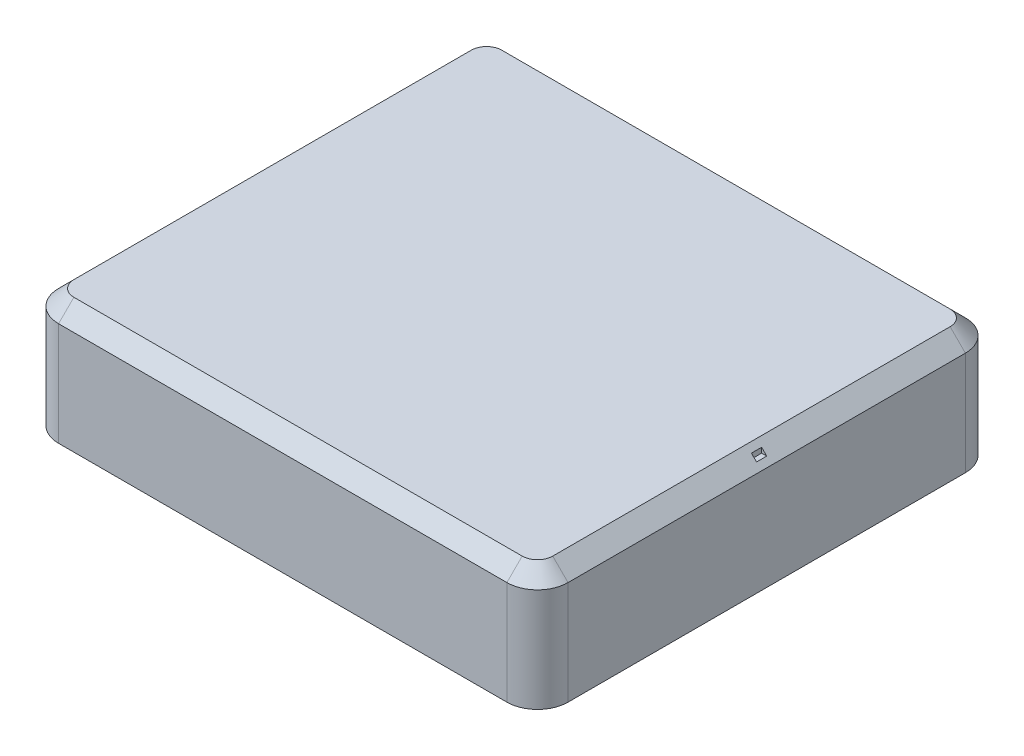
ISO-10303-21;
HEADER;
FILE_DESCRIPTION(('STEP AP214'),'2;1');
FILE_NAME('part.step','',(''),(''),'','','');
FILE_SCHEMA(('AUTOMOTIVE_DESIGN { 1 0 10303 214 1 1 1 1 }'));
ENDSEC;
DATA;
#1=APPLICATION_CONTEXT('core data for automotive mechanical design processes');
#2=APPLICATION_PROTOCOL_DEFINITION('international standard','automotive_design',2000,#1);
#3=PRODUCT_CONTEXT('',#1,'mechanical');
#4=PRODUCT('Part','Part','',(#3));
#5=PRODUCT_RELATED_PRODUCT_CATEGORY('part','',(#4));
#6=PRODUCT_DEFINITION_FORMATION('','',#4);
#7=PRODUCT_DEFINITION_CONTEXT('part definition',#1,'design');
#8=PRODUCT_DEFINITION('design','',#6,#7);
#9=PRODUCT_DEFINITION_SHAPE('','',#8);
#10=(LENGTH_UNIT() NAMED_UNIT(*) SI_UNIT(.MILLI.,.METRE.));
#11=(NAMED_UNIT(*) PLANE_ANGLE_UNIT() SI_UNIT($,.RADIAN.));
#12=(NAMED_UNIT(*) SI_UNIT($,.STERADIAN.) SOLID_ANGLE_UNIT());
#13=UNCERTAINTY_MEASURE_WITH_UNIT(LENGTH_MEASURE(1.E-05),#10,'distance_accuracy_value','');
#14=(GEOMETRIC_REPRESENTATION_CONTEXT(3) GLOBAL_UNCERTAINTY_ASSIGNED_CONTEXT((#13)) GLOBAL_UNIT_ASSIGNED_CONTEXT((#10,
#11,#12)) REPRESENTATION_CONTEXT('',''));
#15=CARTESIAN_POINT('',(0.,0.,0.));
#16=DIRECTION('',(0.,0.,1.));
#17=DIRECTION('',(1.,0.,0.));
#18=AXIS2_PLACEMENT_3D('',#15,#16,#17);
#19=CARTESIAN_POINT('',(0.,0.,45.));
#20=DIRECTION('',(0.,1.,0.));
#21=DIRECTION('',(0.,0.,1.));
#22=AXIS2_PLACEMENT_3D('',#19,#20,#21);
#23=PLANE('',#22);
#24=DIRECTION('',(1.,0.,0.));
#25=VECTOR('',#24,1.);
#26=CARTESIAN_POINT('',(1.3,0.,1.3));
#27=LINE('',#26,#25);
#28=CARTESIAN_POINT('',(2.3,0.,1.3));
#29=VERTEX_POINT('',#28);
#30=CARTESIAN_POINT('',(47.7,0.,1.3));
#31=VERTEX_POINT('',#30);
#32=EDGE_CURVE('E332',#29,#31,#27,.T.);
#33=ORIENTED_EDGE('',*,*,#32,.F.);
#34=CARTESIAN_POINT('',(2.30000000000001,0.,2.3));
#35=DIRECTION('',(0.,1.,0.));
#36=DIRECTION('',(0.,0.,1.));
#37=AXIS2_PLACEMENT_3D('',#34,#35,#36);
#38=CIRCLE('',#37,1.);
#39=CARTESIAN_POINT('',(1.3,0.,2.3));
#40=VERTEX_POINT('',#39);
#41=EDGE_CURVE('E178',#29,#40,#38,.T.);
#42=ORIENTED_EDGE('',*,*,#41,.T.);
#43=DIRECTION('',(0.,0.,-1.));
#44=VECTOR('',#43,1.);
#45=CARTESIAN_POINT('',(1.3,0.,43.7));
#46=LINE('',#45,#44);
#47=CARTESIAN_POINT('',(1.3,0.,42.7));
#48=VERTEX_POINT('',#47);
#49=EDGE_CURVE('E315',#48,#40,#46,.T.);
#50=ORIENTED_EDGE('',*,*,#49,.F.);
#51=CARTESIAN_POINT('',(2.3,0.,42.7));
#52=DIRECTION('',(0.,1.,0.));
#53=DIRECTION('',(0.,0.,1.));
#54=AXIS2_PLACEMENT_3D('',#51,#52,#53);
#55=CIRCLE('',#54,1.);
#56=CARTESIAN_POINT('',(2.3,0.,43.7));
#57=VERTEX_POINT('',#56);
#58=EDGE_CURVE('E187',#48,#57,#55,.T.);
#59=ORIENTED_EDGE('',*,*,#58,.T.);
#60=DIRECTION('',(-1.,0.,0.));
#61=VECTOR('',#60,1.);
#62=CARTESIAN_POINT('',(1.3,0.,43.7));
#63=LINE('',#62,#61);
#64=CARTESIAN_POINT('',(47.7,0.,43.7));
#65=VERTEX_POINT('',#64);
#66=EDGE_CURVE('E320',#65,#57,#63,.T.);
#67=ORIENTED_EDGE('',*,*,#66,.F.);
#68=CARTESIAN_POINT('',(47.7,0.,42.7));
#69=DIRECTION('',(0.,1.,0.));
#70=DIRECTION('',(0.,0.,1.));
#71=AXIS2_PLACEMENT_3D('',#68,#69,#70);
#72=CIRCLE('',#71,1.);
#73=CARTESIAN_POINT('',(48.7,0.,42.7));
#74=VERTEX_POINT('',#73);
#75=EDGE_CURVE('E184',#65,#74,#72,.T.);
#76=ORIENTED_EDGE('',*,*,#75,.T.);
#77=DIRECTION('',(0.,0.,1.));
#78=VECTOR('',#77,1.);
#79=CARTESIAN_POINT('',(48.7,0.,43.7));
#80=LINE('',#79,#78);
#81=CARTESIAN_POINT('',(48.7,0.,2.3));
#82=VERTEX_POINT('',#81);
#83=EDGE_CURVE('E335',#82,#74,#80,.T.);
#84=ORIENTED_EDGE('',*,*,#83,.F.);
#85=CARTESIAN_POINT('',(47.7,0.,2.3));
#86=DIRECTION('',(0.,1.,0.));
#87=DIRECTION('',(0.,0.,1.));
#88=AXIS2_PLACEMENT_3D('',#85,#86,#87);
#89=CIRCLE('',#88,1.);
#90=EDGE_CURVE('E181',#82,#31,#89,.T.);
#91=ORIENTED_EDGE('',*,*,#90,.T.);
#92=EDGE_LOOP('',(#33,#42,#50,#59,#67,#76,#84,#91));
#93=FACE_BOUND('',#92,.T.);
#94=DIRECTION('',(0.,0.,-1.));
#95=VECTOR('',#94,1.);
#96=CARTESIAN_POINT('',(0.,0.,45.));
#97=LINE('',#96,#95);
#98=CARTESIAN_POINT('',(0.,0.,42.));
#99=VERTEX_POINT('',#98);
#100=CARTESIAN_POINT('',(0.,0.,3.00000000000002));
#101=VERTEX_POINT('',#100);
#102=EDGE_CURVE('E139',#99,#101,#97,.T.);
#103=ORIENTED_EDGE('',*,*,#102,.T.);
#104=CARTESIAN_POINT('',(3.,0.,3.));
#105=DIRECTION('',(0.,1.,0.));
#106=DIRECTION('',(0.,0.,1.));
#107=AXIS2_PLACEMENT_3D('',#104,#105,#106);
#108=CIRCLE('',#107,3.);
#109=CARTESIAN_POINT('',(3.,0.,0.));
#110=VERTEX_POINT('',#109);
#111=EDGE_CURVE('E203',#101,#110,#108,.F.);
#112=ORIENTED_EDGE('',*,*,#111,.T.);
#113=DIRECTION('',(1.,0.,0.));
#114=VECTOR('',#113,1.);
#115=CARTESIAN_POINT('',(0.,0.,0.));
#116=LINE('',#115,#114);
#117=CARTESIAN_POINT('',(47.,0.,0.));
#118=VERTEX_POINT('',#117);
#119=EDGE_CURVE('E101',#110,#118,#116,.T.);
#120=ORIENTED_EDGE('',*,*,#119,.T.);
#121=CARTESIAN_POINT('',(47.,0.,3.));
#122=DIRECTION('',(0.,1.,0.));
#123=DIRECTION('',(0.,0.,1.));
#124=AXIS2_PLACEMENT_3D('',#121,#122,#123);
#125=CIRCLE('',#124,3.);
#126=CARTESIAN_POINT('',(50.,0.,3.00000000000002));
#127=VERTEX_POINT('',#126);
#128=EDGE_CURVE('E200',#118,#127,#125,.F.);
#129=ORIENTED_EDGE('',*,*,#128,.T.);
#130=DIRECTION('',(0.,0.,-1.));
#131=VECTOR('',#130,1.);
#132=CARTESIAN_POINT('',(50.,0.,45.));
#133=LINE('',#132,#131);
#134=CARTESIAN_POINT('',(50.,0.,42.));
#135=VERTEX_POINT('',#134);
#136=EDGE_CURVE('E134',#135,#127,#133,.T.);
#137=ORIENTED_EDGE('',*,*,#136,.F.);
#138=CARTESIAN_POINT('',(47.,0.,42.));
#139=DIRECTION('',(0.,1.,0.));
#140=DIRECTION('',(0.,0.,1.));
#141=AXIS2_PLACEMENT_3D('',#138,#139,#140);
#142=CIRCLE('',#141,3.);
#143=CARTESIAN_POINT('',(47.,0.,45.));
#144=VERTEX_POINT('',#143);
#145=EDGE_CURVE('E194',#135,#144,#142,.F.);
#146=ORIENTED_EDGE('',*,*,#145,.T.);
#147=DIRECTION('',(1.,0.,0.));
#148=VECTOR('',#147,1.);
#149=CARTESIAN_POINT('',(0.,0.,45.));
#150=LINE('',#149,#148);
#151=CARTESIAN_POINT('',(3.,0.,45.));
#152=VERTEX_POINT('',#151);
#153=EDGE_CURVE('E131',#152,#144,#150,.T.);
#154=ORIENTED_EDGE('',*,*,#153,.F.);
#155=CARTESIAN_POINT('',(3.,0.,42.));
#156=DIRECTION('',(0.,1.,0.));
#157=DIRECTION('',(0.,0.,1.));
#158=AXIS2_PLACEMENT_3D('',#155,#156,#157);
#159=CIRCLE('',#158,3.);
#160=EDGE_CURVE('E197',#152,#99,#159,.F.);
#161=ORIENTED_EDGE('',*,*,#160,.T.);
#162=EDGE_LOOP('',(#103,#112,#120,#129,#137,#146,#154,#161));
#163=FACE_BOUND('',#162,.T.);
#164=ADVANCED_FACE('F39',(#93,#163),#23,.F.);
#165=CARTESIAN_POINT('',(0.,0.,45.));
#166=DIRECTION('',(1.,0.,0.));
#167=DIRECTION('',(0.,0.,-1.));
#168=AXIS2_PLACEMENT_3D('',#165,#166,#167);
#169=PLANE('',#168);
#170=DIRECTION('',(0.,-1.,0.));
#171=VECTOR('',#170,1.);
#172=CARTESIAN_POINT('',(0.,0.,42.));
#173=LINE('',#172,#171);
#174=CARTESIAN_POINT('',(0.,10.1666666666667,42.));
#175=VERTEX_POINT('',#174);
#176=EDGE_CURVE('E190',#99,#175,#173,.F.);
#177=ORIENTED_EDGE('',*,*,#176,.T.);
#178=DIRECTION('',(0.,0.,-1.));
#179=VECTOR('',#178,1.);
#180=CARTESIAN_POINT('',(0.,10.1666666666667,45.));
#181=LINE('',#180,#179);
#182=CARTESIAN_POINT('',(0.,10.1666666666667,3.));
#183=VERTEX_POINT('',#182);
#184=EDGE_CURVE('E11',#175,#183,#181,.T.);
#185=ORIENTED_EDGE('',*,*,#184,.T.);
#186=DIRECTION('',(0.,-1.,0.));
#187=VECTOR('',#186,1.);
#188=CARTESIAN_POINT('',(0.,0.,3.));
#189=LINE('',#188,#187);
#190=EDGE_CURVE('E192',#183,#101,#189,.T.);
#191=ORIENTED_EDGE('',*,*,#190,.T.);
#192=ORIENTED_EDGE('',*,*,#102,.F.);
#193=EDGE_LOOP('',(#177,#185,#191,#192));
#194=FACE_BOUND('',#193,.T.);
#195=ADVANCED_FACE('F574',(#194),#169,.F.);
#196=CARTESIAN_POINT('',(50.,0.,45.));
#197=DIRECTION('',(-1.,0.,0.));
#198=DIRECTION('',(0.,0.,1.));
#199=AXIS2_PLACEMENT_3D('',#196,#197,#198);
#200=PLANE('',#199);
#201=DIRECTION('',(0.,1.,0.));
#202=VECTOR('',#201,1.);
#203=CARTESIAN_POINT('',(50.,11.6666666666667,3.));
#204=LINE('',#203,#202);
#205=CARTESIAN_POINT('',(50.,10.1666666666667,3.));
#206=VERTEX_POINT('',#205);
#207=EDGE_CURVE('E215',#127,#206,#204,.T.);
#208=ORIENTED_EDGE('',*,*,#207,.T.);
#209=DIRECTION('',(0.,0.,1.));
#210=VECTOR('',#209,1.);
#211=CARTESIAN_POINT('',(50.,10.1666666666667,45.));
#212=LINE('',#211,#210);
#213=CARTESIAN_POINT('',(50.,10.1666666666667,42.));
#214=VERTEX_POINT('',#213);
#215=EDGE_CURVE('E248',#206,#214,#212,.T.);
#216=ORIENTED_EDGE('',*,*,#215,.T.);
#217=DIRECTION('',(0.,1.,0.));
#218=VECTOR('',#217,1.);
#219=CARTESIAN_POINT('',(50.,0.,42.));
#220=LINE('',#219,#218);
#221=EDGE_CURVE('E212',#214,#135,#220,.F.);
#222=ORIENTED_EDGE('',*,*,#221,.T.);
#223=ORIENTED_EDGE('',*,*,#136,.T.);
#224=EDGE_LOOP('',(#208,#216,#222,#223));
#225=FACE_BOUND('',#224,.T.);
#226=ADVANCED_FACE('F544',(#225),#200,.F.);
#227=CARTESIAN_POINT('',(0.,11.6666666666667,45.));
#228=DIRECTION('',(0.,-1.,0.));
#229=DIRECTION('',(0.,0.,-1.));
#230=AXIS2_PLACEMENT_3D('',#227,#228,#229);
#231=PLANE('',#230);
#232=CARTESIAN_POINT('',(47.,11.6666666666667,42.));
#233=DIRECTION('',(0.,-1.,0.));
#234=DIRECTION('',(0.,0.,-1.));
#235=AXIS2_PLACEMENT_3D('',#232,#233,#234);
#236=CIRCLE('',#235,1.49999999999999);
#237=CARTESIAN_POINT('',(47.,11.6666666666667,43.5));
#238=VERTEX_POINT('',#237);
#239=CARTESIAN_POINT('',(48.5,11.6666666666667,42.));
#240=VERTEX_POINT('',#239);
#241=EDGE_CURVE('E242',#238,#240,#236,.F.);
#242=ORIENTED_EDGE('',*,*,#241,.T.);
#243=DIRECTION('',(0.,0.,-1.));
#244=VECTOR('',#243,1.);
#245=CARTESIAN_POINT('',(48.5,11.6666666666667,45.));
#246=LINE('',#245,#244);
#247=CARTESIAN_POINT('',(48.5,11.6666666666667,3.));
#248=VERTEX_POINT('',#247);
#249=EDGE_CURVE('E245',#240,#248,#246,.T.);
#250=ORIENTED_EDGE('',*,*,#249,.T.);
#251=CARTESIAN_POINT('',(47.,11.6666666666667,3.));
#252=DIRECTION('',(0.,-1.,0.));
#253=DIRECTION('',(0.,0.,-1.));
#254=AXIS2_PLACEMENT_3D('',#251,#252,#253);
#255=CIRCLE('',#254,1.49999999999999);
#256=CARTESIAN_POINT('',(47.,11.6666666666667,1.50000000000001));
#257=VERTEX_POINT('',#256);
#258=EDGE_CURVE('E239',#248,#257,#255,.F.);
#259=ORIENTED_EDGE('',*,*,#258,.T.);
#260=DIRECTION('',(-1.,0.,0.));
#261=VECTOR('',#260,1.);
#262=CARTESIAN_POINT('',(3.,11.6666666666667,1.50000000000001));
#263=LINE('',#262,#261);
#264=CARTESIAN_POINT('',(3.,11.6666666666667,1.50000000000001));
#265=VERTEX_POINT('',#264);
#266=EDGE_CURVE('E233',#257,#265,#263,.T.);
#267=ORIENTED_EDGE('',*,*,#266,.T.);
#268=CARTESIAN_POINT('',(3.,11.6666666666667,3.));
#269=DIRECTION('',(0.,-1.,0.));
#270=DIRECTION('',(0.,0.,-1.));
#271=AXIS2_PLACEMENT_3D('',#268,#269,#270);
#272=CIRCLE('',#271,1.49999999999999);
#273=CARTESIAN_POINT('',(1.50000000000001,11.6666666666667,3.));
#274=VERTEX_POINT('',#273);
#275=EDGE_CURVE('E227',#265,#274,#272,.F.);
#276=ORIENTED_EDGE('',*,*,#275,.T.);
#277=DIRECTION('',(0.,0.,1.));
#278=VECTOR('',#277,1.);
#279=CARTESIAN_POINT('',(1.50000000000001,11.6666666666667,45.));
#280=LINE('',#279,#278);
#281=CARTESIAN_POINT('',(1.50000000000001,11.6666666666667,42.));
#282=VERTEX_POINT('',#281);
#283=EDGE_CURVE('E224',#274,#282,#280,.T.);
#284=ORIENTED_EDGE('',*,*,#283,.T.);
#285=CARTESIAN_POINT('',(3.,11.6666666666667,42.));
#286=DIRECTION('',(0.,-1.,0.));
#287=DIRECTION('',(0.,0.,-1.));
#288=AXIS2_PLACEMENT_3D('',#285,#286,#287);
#289=CIRCLE('',#288,1.49999999999999);
#290=CARTESIAN_POINT('',(3.,11.6666666666667,43.5));
#291=VERTEX_POINT('',#290);
#292=EDGE_CURVE('E230',#282,#291,#289,.F.);
#293=ORIENTED_EDGE('',*,*,#292,.T.);
#294=DIRECTION('',(1.,0.,0.));
#295=VECTOR('',#294,1.);
#296=CARTESIAN_POINT('',(0.,11.6666666666667,43.5));
#297=LINE('',#296,#295);
#298=EDGE_CURVE('E236',#291,#238,#297,.T.);
#299=ORIENTED_EDGE('',*,*,#298,.T.);
#300=EDGE_LOOP('',(#242,#250,#259,#267,#276,#284,#293,#299));
#301=FACE_BOUND('',#300,.T.);
#302=ADVANCED_FACE('F579',(#301),#231,.F.);
#303=CARTESIAN_POINT('',(0.,0.,45.));
#304=DIRECTION('',(0.,0.,-1.));
#305=DIRECTION('',(-1.,0.,0.));
#306=AXIS2_PLACEMENT_3D('',#303,#304,#305);
#307=PLANE('',#306);
#308=DIRECTION('',(0.,1.,0.));
#309=VECTOR('',#308,1.);
#310=CARTESIAN_POINT('',(47.,0.,45.));
#311=LINE('',#310,#309);
#312=CARTESIAN_POINT('',(47.,10.1666666666667,45.));
#313=VERTEX_POINT('',#312);
#314=EDGE_CURVE('E218',#144,#313,#311,.T.);
#315=ORIENTED_EDGE('',*,*,#314,.T.);
#316=DIRECTION('',(-1.,0.,0.));
#317=VECTOR('',#316,1.);
#318=CARTESIAN_POINT('',(0.,10.1666666666667,45.));
#319=LINE('',#318,#317);
#320=CARTESIAN_POINT('',(3.,10.1666666666667,45.));
#321=VERTEX_POINT('',#320);
#322=EDGE_CURVE('E257',#313,#321,#319,.T.);
#323=ORIENTED_EDGE('',*,*,#322,.T.);
#324=DIRECTION('',(0.,-1.,0.));
#325=VECTOR('',#324,1.);
#326=CARTESIAN_POINT('',(3.,0.,45.));
#327=LINE('',#326,#325);
#328=EDGE_CURVE('E221',#321,#152,#327,.T.);
#329=ORIENTED_EDGE('',*,*,#328,.T.);
#330=ORIENTED_EDGE('',*,*,#153,.T.);
#331=EDGE_LOOP('',(#315,#323,#329,#330));
#332=FACE_BOUND('',#331,.T.);
#333=ADVANCED_FACE('F561',(#332),#307,.F.);
#334=CARTESIAN_POINT('',(0.,0.,0.));
#335=DIRECTION('',(0.,0.,-1.));
#336=DIRECTION('',(-1.,0.,0.));
#337=AXIS2_PLACEMENT_3D('',#334,#335,#336);
#338=PLANE('',#337);
#339=DIRECTION('',(0.,-1.,0.));
#340=VECTOR('',#339,1.);
#341=CARTESIAN_POINT('',(3.,11.6666666666667,0.));
#342=LINE('',#341,#340);
#343=CARTESIAN_POINT('',(3.,10.1666666666667,0.));
#344=VERTEX_POINT('',#343);
#345=EDGE_CURVE('E209',#110,#344,#342,.F.);
#346=ORIENTED_EDGE('',*,*,#345,.T.);
#347=DIRECTION('',(1.,0.,0.));
#348=VECTOR('',#347,1.);
#349=CARTESIAN_POINT('',(47.,10.1666666666667,0.));
#350=LINE('',#349,#348);
#351=CARTESIAN_POINT('',(47.,10.1666666666667,0.));
#352=VERTEX_POINT('',#351);
#353=EDGE_CURVE('E260',#344,#352,#350,.T.);
#354=ORIENTED_EDGE('',*,*,#353,.T.);
#355=DIRECTION('',(0.,1.,0.));
#356=VECTOR('',#355,1.);
#357=CARTESIAN_POINT('',(47.,0.,0.));
#358=LINE('',#357,#356);
#359=EDGE_CURVE('E206',#352,#118,#358,.F.);
#360=ORIENTED_EDGE('',*,*,#359,.T.);
#361=ORIENTED_EDGE('',*,*,#119,.F.);
#362=EDGE_LOOP('',(#346,#354,#360,#361));
#363=FACE_BOUND('',#362,.T.);
#364=ADVANCED_FACE('F525',(#363),#338,.T.);
#365=CARTESIAN_POINT('',(49.,11.6666666666667,23.));
#366=DIRECTION('',(0.,0.,1.));
#367=DIRECTION('',(1.,0.,0.));
#368=AXIS2_PLACEMENT_3D('',#365,#366,#367);
#369=PLANE('',#368);
#370=DIRECTION('',(-0.707106781186549,0.707106781186546,0.));
#371=VECTOR('',#370,1.);
#372=CARTESIAN_POINT('',(48.5,11.6666666666667,23.));
#373=LINE('',#372,#371);
#374=CARTESIAN_POINT('',(49.25,10.9166666666667,23.));
#375=VERTEX_POINT('',#374);
#376=CARTESIAN_POINT('',(49.5,10.6666666666667,23.));
#377=VERTEX_POINT('',#376);
#378=EDGE_CURVE('E111',#375,#377,#373,.F.);
#379=ORIENTED_EDGE('',*,*,#378,.T.);
#380=DIRECTION('',(1.,0.,0.));
#381=VECTOR('',#380,1.);
#382=CARTESIAN_POINT('',(49.,10.6666666666667,23.));
#383=LINE('',#382,#381);
#384=CARTESIAN_POINT('',(49.,10.6666666666667,23.));
#385=VERTEX_POINT('',#384);
#386=EDGE_CURVE('E103',#385,#377,#383,.T.);
#387=ORIENTED_EDGE('',*,*,#386,.F.);
#388=DIRECTION('',(0.,-1.,0.));
#389=VECTOR('',#388,1.);
#390=CARTESIAN_POINT('',(49.,11.6666666666667,23.));
#391=LINE('',#390,#389);
#392=CARTESIAN_POINT('',(49.,11.1666666666667,23.));
#393=VERTEX_POINT('',#392);
#394=EDGE_CURVE('E94',#393,#385,#391,.T.);
#395=ORIENTED_EDGE('',*,*,#394,.F.);
#396=DIRECTION('',(-0.707106781186549,0.707106781186546,0.));
#397=VECTOR('',#396,1.);
#398=CARTESIAN_POINT('',(48.5,11.6666666666667,23.));
#399=LINE('',#398,#397);
#400=EDGE_CURVE('E99',#393,#375,#399,.F.);
#401=ORIENTED_EDGE('',*,*,#400,.T.);
#402=EDGE_LOOP('',(#379,#387,#395,#401));
#403=FACE_BOUND('',#402,.T.);
#404=ADVANCED_FACE('F120',(#403),#369,.F.);
#405=CARTESIAN_POINT('',(49.,11.6666666666667,22.));
#406=DIRECTION('',(0.,0.,-1.));
#407=DIRECTION('',(-1.,0.,0.));
#408=AXIS2_PLACEMENT_3D('',#405,#406,#407);
#409=PLANE('',#408);
#410=DIRECTION('',(0.707106781186549,-0.707106781186546,0.));
#411=VECTOR('',#410,1.);
#412=CARTESIAN_POINT('',(48.5,11.6666666666667,22.));
#413=LINE('',#412,#411);
#414=CARTESIAN_POINT('',(49.5,10.6666666666667,22.));
#415=VERTEX_POINT('',#414);
#416=CARTESIAN_POINT('',(49.25,10.9166666666667,22.));
#417=VERTEX_POINT('',#416);
#418=EDGE_CURVE('E43',#415,#417,#413,.F.);
#419=ORIENTED_EDGE('',*,*,#418,.T.);
#420=DIRECTION('',(-0.707106781186549,0.707106781186546,0.));
#421=VECTOR('',#420,1.);
#422=CARTESIAN_POINT('',(48.75,11.4166666666667,22.));
#423=LINE('',#422,#421);
#424=CARTESIAN_POINT('',(49.,11.1666666666667,22.));
#425=VERTEX_POINT('',#424);
#426=EDGE_CURVE('E90',#425,#417,#423,.F.);
#427=ORIENTED_EDGE('',*,*,#426,.F.);
#428=DIRECTION('',(0.,1.,0.));
#429=VECTOR('',#428,1.);
#430=CARTESIAN_POINT('',(49.,11.6666666666667,22.));
#431=LINE('',#430,#429);
#432=CARTESIAN_POINT('',(49.,10.6666666666667,22.));
#433=VERTEX_POINT('',#432);
#434=EDGE_CURVE('E109',#433,#425,#431,.T.);
#435=ORIENTED_EDGE('',*,*,#434,.F.);
#436=DIRECTION('',(1.,0.,0.));
#437=VECTOR('',#436,1.);
#438=CARTESIAN_POINT('',(49.,10.6666666666667,22.));
#439=LINE('',#438,#437);
#440=EDGE_CURVE('E84',#433,#415,#439,.T.);
#441=ORIENTED_EDGE('',*,*,#440,.T.);
#442=EDGE_LOOP('',(#419,#427,#435,#441));
#443=FACE_BOUND('',#442,.T.);
#444=ADVANCED_FACE('F89',(#443),#409,.F.);
#445=CARTESIAN_POINT('',(49.,10.6666666666667,23.));
#446=DIRECTION('',(0.,-1.,0.));
#447=DIRECTION('',(0.,0.,-1.));
#448=AXIS2_PLACEMENT_3D('',#445,#446,#447);
#449=PLANE('',#448);
#450=DIRECTION('',(0.,0.,1.));
#451=VECTOR('',#450,1.);
#452=CARTESIAN_POINT('',(49.5,10.6666666666667,45.));
#453=LINE('',#452,#451);
#454=EDGE_CURVE('E95',#377,#415,#453,.F.);
#455=ORIENTED_EDGE('',*,*,#454,.T.);
#456=ORIENTED_EDGE('',*,*,#440,.F.);
#457=DIRECTION('',(0.,0.,-1.));
#458=VECTOR('',#457,1.);
#459=CARTESIAN_POINT('',(49.,10.6666666666667,23.));
#460=LINE('',#459,#458);
#461=EDGE_CURVE('E124',#385,#433,#460,.T.);
#462=ORIENTED_EDGE('',*,*,#461,.F.);
#463=ORIENTED_EDGE('',*,*,#386,.T.);
#464=EDGE_LOOP('',(#455,#456,#462,#463));
#465=FACE_BOUND('',#464,.T.);
#466=ADVANCED_FACE('F115',(#465),#449,.F.);
#467=CARTESIAN_POINT('',(49.,0.,0.));
#468=DIRECTION('',(1.,0.,0.));
#469=DIRECTION('',(0.,0.,-1.));
#470=AXIS2_PLACEMENT_3D('',#467,#468,#469);
#471=PLANE('',#470);
#472=ORIENTED_EDGE('',*,*,#394,.T.);
#473=ORIENTED_EDGE('',*,*,#461,.T.);
#474=ORIENTED_EDGE('',*,*,#434,.T.);
#475=DIRECTION('',(0.,0.,-1.));
#476=VECTOR('',#475,1.);
#477=CARTESIAN_POINT('',(49.,11.1666666666667,0.));
#478=LINE('',#477,#476);
#479=EDGE_CURVE('E98',#425,#393,#478,.F.);
#480=ORIENTED_EDGE('',*,*,#479,.T.);
#481=EDGE_LOOP('',(#472,#473,#474,#480));
#482=FACE_BOUND('',#481,.T.);
#483=ADVANCED_FACE('F126',(#482),#471,.T.);
#484=CARTESIAN_POINT('',(1.3,2.5,43.7));
#485=DIRECTION('',(-1.,0.,0.));
#486=DIRECTION('',(0.,0.,1.));
#487=AXIS2_PLACEMENT_3D('',#484,#485,#486);
#488=PLANE('',#487);
#489=ORIENTED_EDGE('',*,*,#49,.T.);
#490=DIRECTION('',(0.,-1.,0.));
#491=VECTOR('',#490,1.);
#492=CARTESIAN_POINT('',(1.3,2.5,2.3));
#493=LINE('',#492,#491);
#494=CARTESIAN_POINT('',(1.3,2.5,2.3));
#495=VERTEX_POINT('',#494);
#496=EDGE_CURVE('E151',#40,#495,#493,.F.);
#497=ORIENTED_EDGE('',*,*,#496,.T.);
#498=DIRECTION('',(0.,0.,-1.));
#499=VECTOR('',#498,1.);
#500=CARTESIAN_POINT('',(1.3,2.5,43.7));
#501=LINE('',#500,#499);
#502=CARTESIAN_POINT('',(1.3,2.5,42.7));
#503=VERTEX_POINT('',#502);
#504=EDGE_CURVE('E316',#503,#495,#501,.T.);
#505=ORIENTED_EDGE('',*,*,#504,.F.);
#506=DIRECTION('',(0.,-1.,0.));
#507=VECTOR('',#506,1.);
#508=CARTESIAN_POINT('',(1.3,0.,42.7));
#509=LINE('',#508,#507);
#510=EDGE_CURVE('E148',#503,#48,#509,.T.);
#511=ORIENTED_EDGE('',*,*,#510,.T.);
#512=EDGE_LOOP('',(#489,#497,#505,#511));
#513=FACE_BOUND('',#512,.T.);
#514=ADVANCED_FACE('F726',(#513),#488,.F.);
#515=CARTESIAN_POINT('',(1.3,2.5,43.7));
#516=DIRECTION('',(0.,0.,1.));
#517=DIRECTION('',(1.,0.,0.));
#518=AXIS2_PLACEMENT_3D('',#515,#516,#517);
#519=PLANE('',#518);
#520=DIRECTION('',(-1.,0.,0.));
#521=VECTOR('',#520,1.);
#522=CARTESIAN_POINT('',(1.3,2.5,43.7));
#523=LINE('',#522,#521);
#524=CARTESIAN_POINT('',(47.7,2.5,43.7));
#525=VERTEX_POINT('',#524);
#526=CARTESIAN_POINT('',(2.3,2.5,43.7));
#527=VERTEX_POINT('',#526);
#528=EDGE_CURVE('E326',#525,#527,#523,.T.);
#529=ORIENTED_EDGE('',*,*,#528,.F.);
#530=DIRECTION('',(0.,-1.,0.));
#531=VECTOR('',#530,1.);
#532=CARTESIAN_POINT('',(47.7,0.,43.7));
#533=LINE('',#532,#531);
#534=EDGE_CURVE('E175',#525,#65,#533,.T.);
#535=ORIENTED_EDGE('',*,*,#534,.T.);
#536=ORIENTED_EDGE('',*,*,#66,.T.);
#537=DIRECTION('',(0.,-1.,0.));
#538=VECTOR('',#537,1.);
#539=CARTESIAN_POINT('',(2.3,2.5,43.7));
#540=LINE('',#539,#538);
#541=EDGE_CURVE('E172',#57,#527,#540,.F.);
#542=ORIENTED_EDGE('',*,*,#541,.T.);
#543=EDGE_LOOP('',(#529,#535,#536,#542));
#544=FACE_BOUND('',#543,.T.);
#545=ADVANCED_FACE('F841',(#544),#519,.F.);
#546=CARTESIAN_POINT('',(48.7,2.5,43.7));
#547=DIRECTION('',(1.,0.,0.));
#548=DIRECTION('',(0.,0.,-1.));
#549=AXIS2_PLACEMENT_3D('',#546,#547,#548);
#550=PLANE('',#549);
#551=DIRECTION('',(0.,0.,1.));
#552=VECTOR('',#551,1.);
#553=CARTESIAN_POINT('',(48.7,2.5,43.7));
#554=LINE('',#553,#552);
#555=CARTESIAN_POINT('',(48.7,2.5,2.3));
#556=VERTEX_POINT('',#555);
#557=CARTESIAN_POINT('',(48.7,2.5,42.7));
#558=VERTEX_POINT('',#557);
#559=EDGE_CURVE('E323',#556,#558,#554,.T.);
#560=ORIENTED_EDGE('',*,*,#559,.F.);
#561=DIRECTION('',(0.,-1.,0.));
#562=VECTOR('',#561,1.);
#563=CARTESIAN_POINT('',(48.7,0.,2.3));
#564=LINE('',#563,#562);
#565=EDGE_CURVE('E169',#556,#82,#564,.T.);
#566=ORIENTED_EDGE('',*,*,#565,.T.);
#567=ORIENTED_EDGE('',*,*,#83,.T.);
#568=DIRECTION('',(0.,-1.,0.));
#569=VECTOR('',#568,1.);
#570=CARTESIAN_POINT('',(48.7,2.5,42.7));
#571=LINE('',#570,#569);
#572=EDGE_CURVE('E166',#74,#558,#571,.F.);
#573=ORIENTED_EDGE('',*,*,#572,.T.);
#574=EDGE_LOOP('',(#560,#566,#567,#573));
#575=FACE_BOUND('',#574,.T.);
#576=ADVANCED_FACE('F831',(#575),#550,.F.);
#577=CARTESIAN_POINT('',(1.3,2.5,1.3));
#578=DIRECTION('',(0.,0.,-1.));
#579=DIRECTION('',(-1.,0.,0.));
#580=AXIS2_PLACEMENT_3D('',#577,#578,#579);
#581=PLANE('',#580);
#582=DIRECTION('',(1.,0.,0.));
#583=VECTOR('',#582,1.);
#584=CARTESIAN_POINT('',(1.3,2.5,1.3));
#585=LINE('',#584,#583);
#586=CARTESIAN_POINT('',(2.3,2.5,1.3));
#587=VERTEX_POINT('',#586);
#588=CARTESIAN_POINT('',(47.7,2.5,1.3));
#589=VERTEX_POINT('',#588);
#590=EDGE_CURVE('E319',#587,#589,#585,.T.);
#591=ORIENTED_EDGE('',*,*,#590,.F.);
#592=DIRECTION('',(0.,-1.,0.));
#593=VECTOR('',#592,1.);
#594=CARTESIAN_POINT('',(2.30000000000001,0.,1.3));
#595=LINE('',#594,#593);
#596=EDGE_CURVE('E145',#587,#29,#595,.T.);
#597=ORIENTED_EDGE('',*,*,#596,.T.);
#598=ORIENTED_EDGE('',*,*,#32,.T.);
#599=DIRECTION('',(0.,-1.,0.));
#600=VECTOR('',#599,1.);
#601=CARTESIAN_POINT('',(47.7,2.5,1.3));
#602=LINE('',#601,#600);
#603=EDGE_CURVE('E142',#31,#589,#602,.F.);
#604=ORIENTED_EDGE('',*,*,#603,.T.);
#605=EDGE_LOOP('',(#591,#597,#598,#604));
#606=FACE_BOUND('',#605,.T.);
#607=ADVANCED_FACE('F820',(#606),#581,.F.);
#608=CARTESIAN_POINT('',(0.,2.5,0.));
#609=DIRECTION('',(0.,-1.,0.));
#610=DIRECTION('',(0.,0.,-1.));
#611=AXIS2_PLACEMENT_3D('',#608,#609,#610);
#612=PLANE('',#611);
#613=DIRECTION('',(-1.,0.,0.));
#614=VECTOR('',#613,1.);
#615=CARTESIAN_POINT('',(2.5,2.5,42.5));
#616=LINE('',#615,#614);
#617=CARTESIAN_POINT('',(47.5,2.5,42.5));
#618=VERTEX_POINT('',#617);
#619=CARTESIAN_POINT('',(2.5,2.5,42.5));
#620=VERTEX_POINT('',#619);
#621=EDGE_CURVE('E312',#618,#620,#616,.T.);
#622=ORIENTED_EDGE('',*,*,#621,.F.);
#623=DIRECTION('',(0.,0.,1.));
#624=VECTOR('',#623,1.);
#625=CARTESIAN_POINT('',(47.5,2.5,42.5));
#626=LINE('',#625,#624);
#627=CARTESIAN_POINT('',(47.5,2.5,2.5));
#628=VERTEX_POINT('',#627);
#629=EDGE_CURVE('E307',#628,#618,#626,.T.);
#630=ORIENTED_EDGE('',*,*,#629,.F.);
#631=DIRECTION('',(1.,0.,0.));
#632=VECTOR('',#631,1.);
#633=CARTESIAN_POINT('',(2.5,2.5,2.5));
#634=LINE('',#633,#632);
#635=CARTESIAN_POINT('',(2.5,2.5,2.5));
#636=VERTEX_POINT('',#635);
#637=EDGE_CURVE('E298',#636,#628,#634,.T.);
#638=ORIENTED_EDGE('',*,*,#637,.F.);
#639=DIRECTION('',(0.,0.,-1.));
#640=VECTOR('',#639,1.);
#641=CARTESIAN_POINT('',(2.5,2.5,42.5));
#642=LINE('',#641,#640);
#643=EDGE_CURVE('E292',#620,#636,#642,.T.);
#644=ORIENTED_EDGE('',*,*,#643,.F.);
#645=EDGE_LOOP('',(#622,#630,#638,#644));
#646=FACE_BOUND('',#645,.T.);
#647=ORIENTED_EDGE('',*,*,#504,.T.);
#648=CARTESIAN_POINT('',(2.30000000000001,2.5,2.3));
#649=DIRECTION('',(0.,-1.,0.));
#650=DIRECTION('',(0.,0.,-1.));
#651=AXIS2_PLACEMENT_3D('',#648,#649,#650);
#652=CIRCLE('',#651,1.);
#653=EDGE_CURVE('E163',#495,#587,#652,.T.);
#654=ORIENTED_EDGE('',*,*,#653,.T.);
#655=ORIENTED_EDGE('',*,*,#590,.T.);
#656=CARTESIAN_POINT('',(47.7,2.5,2.3));
#657=DIRECTION('',(0.,-1.,0.));
#658=DIRECTION('',(0.,0.,-1.));
#659=AXIS2_PLACEMENT_3D('',#656,#657,#658);
#660=CIRCLE('',#659,1.);
#661=EDGE_CURVE('E160',#589,#556,#660,.T.);
#662=ORIENTED_EDGE('',*,*,#661,.T.);
#663=ORIENTED_EDGE('',*,*,#559,.T.);
#664=CARTESIAN_POINT('',(47.7,2.5,42.7));
#665=DIRECTION('',(0.,-1.,0.));
#666=DIRECTION('',(0.,0.,-1.));
#667=AXIS2_PLACEMENT_3D('',#664,#665,#666);
#668=CIRCLE('',#667,1.);
#669=EDGE_CURVE('E157',#558,#525,#668,.T.);
#670=ORIENTED_EDGE('',*,*,#669,.T.);
#671=ORIENTED_EDGE('',*,*,#528,.T.);
#672=CARTESIAN_POINT('',(2.3,2.5,42.7));
#673=DIRECTION('',(0.,-1.,0.));
#674=DIRECTION('',(0.,0.,-1.));
#675=AXIS2_PLACEMENT_3D('',#672,#673,#674);
#676=CIRCLE('',#675,1.);
#677=EDGE_CURVE('E154',#527,#503,#676,.T.);
#678=ORIENTED_EDGE('',*,*,#677,.T.);
#679=EDGE_LOOP('',(#647,#654,#655,#662,#663,#670,#671,#678));
#680=FACE_BOUND('',#679,.T.);
#681=ADVANCED_FACE('F815',(#646,#680),#612,.T.);
#682=CARTESIAN_POINT('',(46.5,0.,0.));
#683=DIRECTION('',(1.,0.,0.));
#684=DIRECTION('',(0.,0.,-1.));
#685=AXIS2_PLACEMENT_3D('',#682,#683,#684);
#686=PLANE('',#685);
#687=DIRECTION('',(0.,-1.,0.));
#688=VECTOR('',#687,1.);
#689=CARTESIAN_POINT('',(46.5,0.,25.5));
#690=LINE('',#689,#688);
#691=CARTESIAN_POINT('',(46.5,9.16666666666666,25.5));
#692=VERTEX_POINT('',#691);
#693=CARTESIAN_POINT('',(46.5,8.16666666666666,25.5));
#694=VERTEX_POINT('',#693);
#695=EDGE_CURVE('E384',#692,#694,#690,.T.);
#696=ORIENTED_EDGE('',*,*,#695,.F.);
#697=DIRECTION('',(0.,0.,1.));
#698=VECTOR('',#697,1.);
#699=CARTESIAN_POINT('',(46.5,9.16666666666666,45.));
#700=LINE('',#699,#698);
#701=CARTESIAN_POINT('',(46.5,9.16666666666666,19.5));
#702=VERTEX_POINT('',#701);
#703=EDGE_CURVE('E358',#702,#692,#700,.T.);
#704=ORIENTED_EDGE('',*,*,#703,.F.);
#705=DIRECTION('',(0.,1.,0.));
#706=VECTOR('',#705,1.);
#707=CARTESIAN_POINT('',(46.5,0.,19.5));
#708=LINE('',#707,#706);
#709=CARTESIAN_POINT('',(46.5,8.16666666666666,19.5));
#710=VERTEX_POINT('',#709);
#711=EDGE_CURVE('E362',#710,#702,#708,.T.);
#712=ORIENTED_EDGE('',*,*,#711,.F.);
#713=DIRECTION('',(0.,0.,-1.));
#714=VECTOR('',#713,1.);
#715=CARTESIAN_POINT('',(46.5,8.16666666666666,0.));
#716=LINE('',#715,#714);
#717=EDGE_CURVE('E389',#694,#710,#716,.T.);
#718=ORIENTED_EDGE('',*,*,#717,.F.);
#719=EDGE_LOOP('',(#696,#704,#712,#718));
#720=FACE_BOUND('',#719,.T.);
#721=ADVANCED_FACE('F416',(#720),#686,.F.);
#722=CARTESIAN_POINT('',(49.,11.6666666666667,19.5));
#723=DIRECTION('',(0.,0.,-1.));
#724=DIRECTION('',(-1.,0.,0.));
#725=AXIS2_PLACEMENT_3D('',#722,#723,#724);
#726=PLANE('',#725);
#727=DIRECTION('',(0.,1.,0.));
#728=VECTOR('',#727,1.);
#729=CARTESIAN_POINT('',(47.5,11.6666666666667,19.5));
#730=LINE('',#729,#728);
#731=CARTESIAN_POINT('',(47.5,8.16666666666666,19.5));
#732=VERTEX_POINT('',#731);
#733=CARTESIAN_POINT('',(47.5,9.16666666666666,19.5));
#734=VERTEX_POINT('',#733);
#735=EDGE_CURVE('E375',#732,#734,#730,.T.);
#736=ORIENTED_EDGE('',*,*,#735,.F.);
#737=DIRECTION('',(1.,0.,0.));
#738=VECTOR('',#737,1.);
#739=CARTESIAN_POINT('',(49.,8.16666666666666,19.5));
#740=LINE('',#739,#738);
#741=EDGE_CURVE('E365',#710,#732,#740,.T.);
#742=ORIENTED_EDGE('',*,*,#741,.F.);
#743=ORIENTED_EDGE('',*,*,#711,.T.);
#744=DIRECTION('',(1.,0.,0.));
#745=VECTOR('',#744,1.);
#746=CARTESIAN_POINT('',(0.,9.16666666666666,19.5));
#747=LINE('',#746,#745);
#748=EDGE_CURVE('E357',#702,#734,#747,.T.);
#749=ORIENTED_EDGE('',*,*,#748,.T.);
#750=EDGE_LOOP('',(#736,#742,#743,#749));
#751=FACE_BOUND('',#750,.T.);
#752=ADVANCED_FACE('F400',(#751),#726,.T.);
#753=CARTESIAN_POINT('',(49.,8.16666666666666,23.));
#754=DIRECTION('',(0.,-1.,0.));
#755=DIRECTION('',(0.,0.,-1.));
#756=AXIS2_PLACEMENT_3D('',#753,#754,#755);
#757=PLANE('',#756);
#758=DIRECTION('',(0.,0.,-1.));
#759=VECTOR('',#758,1.);
#760=CARTESIAN_POINT('',(47.5,8.16666666666666,23.));
#761=LINE('',#760,#759);
#762=CARTESIAN_POINT('',(47.5,8.16666666666666,25.5));
#763=VERTEX_POINT('',#762);
#764=EDGE_CURVE('E372',#763,#732,#761,.T.);
#765=ORIENTED_EDGE('',*,*,#764,.F.);
#766=DIRECTION('',(1.,0.,0.));
#767=VECTOR('',#766,1.);
#768=CARTESIAN_POINT('',(49.,8.16666666666666,25.5));
#769=LINE('',#768,#767);
#770=EDGE_CURVE('E361',#694,#763,#769,.T.);
#771=ORIENTED_EDGE('',*,*,#770,.F.);
#772=ORIENTED_EDGE('',*,*,#717,.T.);
#773=ORIENTED_EDGE('',*,*,#741,.T.);
#774=EDGE_LOOP('',(#765,#771,#772,#773));
#775=FACE_BOUND('',#774,.T.);
#776=ADVANCED_FACE('F910',(#775),#757,.T.);
#777=CARTESIAN_POINT('',(49.,11.6666666666667,25.5));
#778=DIRECTION('',(0.,0.,1.));
#779=DIRECTION('',(1.,0.,0.));
#780=AXIS2_PLACEMENT_3D('',#777,#778,#779);
#781=PLANE('',#780);
#782=DIRECTION('',(0.,-1.,0.));
#783=VECTOR('',#782,1.);
#784=CARTESIAN_POINT('',(47.5,11.6666666666667,25.5));
#785=LINE('',#784,#783);
#786=CARTESIAN_POINT('',(47.5,9.16666666666666,25.5));
#787=VERTEX_POINT('',#786);
#788=EDGE_CURVE('E329',#787,#763,#785,.T.);
#789=ORIENTED_EDGE('',*,*,#788,.F.);
#790=DIRECTION('',(1.,0.,0.));
#791=VECTOR('',#790,1.);
#792=CARTESIAN_POINT('',(49.,9.16666666666666,25.5));
#793=LINE('',#792,#791);
#794=EDGE_CURVE('E343',#692,#787,#793,.T.);
#795=ORIENTED_EDGE('',*,*,#794,.F.);
#796=ORIENTED_EDGE('',*,*,#695,.T.);
#797=ORIENTED_EDGE('',*,*,#770,.T.);
#798=EDGE_LOOP('',(#789,#795,#796,#797));
#799=FACE_BOUND('',#798,.T.);
#800=ADVANCED_FACE('F422',(#799),#781,.T.);
#801=CARTESIAN_POINT('',(0.,9.16666666666666,45.));
#802=DIRECTION('',(0.,-1.,0.));
#803=DIRECTION('',(0.,0.,-1.));
#804=AXIS2_PLACEMENT_3D('',#801,#802,#803);
#805=PLANE('',#804);
#806=DIRECTION('',(0.,0.,-1.));
#807=VECTOR('',#806,1.);
#808=CARTESIAN_POINT('',(47.5,9.16666666666666,45.));
#809=LINE('',#808,#807);
#810=CARTESIAN_POINT('',(47.5,9.16666666666666,42.5));
#811=VERTEX_POINT('',#810);
#812=EDGE_CURVE('E113',#811,#787,#809,.T.);
#813=ORIENTED_EDGE('',*,*,#812,.F.);
#814=DIRECTION('',(-1.,0.,0.));
#815=VECTOR('',#814,1.);
#816=CARTESIAN_POINT('',(0.,9.16666666666666,42.5));
#817=LINE('',#816,#815);
#818=CARTESIAN_POINT('',(2.5,9.16666666666666,42.5));
#819=VERTEX_POINT('',#818);
#820=EDGE_CURVE('E352',#811,#819,#817,.T.);
#821=ORIENTED_EDGE('',*,*,#820,.T.);
#822=DIRECTION('',(0.,0.,-1.));
#823=VECTOR('',#822,1.);
#824=CARTESIAN_POINT('',(2.5,9.16666666666666,45.));
#825=LINE('',#824,#823);
#826=CARTESIAN_POINT('',(2.5,9.16666666666666,2.5));
#827=VERTEX_POINT('',#826);
#828=EDGE_CURVE('E348',#819,#827,#825,.T.);
#829=ORIENTED_EDGE('',*,*,#828,.T.);
#830=DIRECTION('',(-1.,0.,0.));
#831=VECTOR('',#830,1.);
#832=CARTESIAN_POINT('',(0.,9.16666666666666,2.5));
#833=LINE('',#832,#831);
#834=CARTESIAN_POINT('',(47.5,9.16666666666666,2.5));
#835=VERTEX_POINT('',#834);
#836=EDGE_CURVE('E347',#835,#827,#833,.T.);
#837=ORIENTED_EDGE('',*,*,#836,.F.);
#838=DIRECTION('',(0.,0.,-1.));
#839=VECTOR('',#838,1.);
#840=CARTESIAN_POINT('',(47.5,9.16666666666666,45.));
#841=LINE('',#840,#839);
#842=EDGE_CURVE('E351',#734,#835,#841,.T.);
#843=ORIENTED_EDGE('',*,*,#842,.F.);
#844=ORIENTED_EDGE('',*,*,#748,.F.);
#845=ORIENTED_EDGE('',*,*,#703,.T.);
#846=ORIENTED_EDGE('',*,*,#794,.T.);
#847=EDGE_LOOP('',(#813,#821,#829,#837,#843,#844,#845,#846));
#848=FACE_BOUND('',#847,.T.);
#849=ADVANCED_FACE('F411',(#848),#805,.T.);
#850=CARTESIAN_POINT('',(0.,0.,42.5));
#851=DIRECTION('',(0.,0.,-1.));
#852=DIRECTION('',(-1.,0.,0.));
#853=AXIS2_PLACEMENT_3D('',#850,#851,#852);
#854=PLANE('',#853);
#855=DIRECTION('',(0.,1.,0.));
#856=VECTOR('',#855,1.);
#857=CARTESIAN_POINT('',(47.5,0.,42.5));
#858=LINE('',#857,#856);
#859=EDGE_CURVE('E346',#618,#811,#858,.T.);
#860=ORIENTED_EDGE('',*,*,#859,.F.);
#861=ORIENTED_EDGE('',*,*,#621,.T.);
#862=DIRECTION('',(0.,-1.,0.));
#863=VECTOR('',#862,1.);
#864=CARTESIAN_POINT('',(2.5,0.,42.5));
#865=LINE('',#864,#863);
#866=EDGE_CURVE('E344',#819,#620,#865,.T.);
#867=ORIENTED_EDGE('',*,*,#866,.F.);
#868=ORIENTED_EDGE('',*,*,#820,.F.);
#869=EDGE_LOOP('',(#860,#861,#867,#868));
#870=FACE_BOUND('',#869,.T.);
#871=ADVANCED_FACE('F887',(#870),#854,.T.);
#872=CARTESIAN_POINT('',(0.,0.,2.5));
#873=DIRECTION('',(0.,0.,-1.));
#874=DIRECTION('',(-1.,0.,0.));
#875=AXIS2_PLACEMENT_3D('',#872,#873,#874);
#876=PLANE('',#875);
#877=ORIENTED_EDGE('',*,*,#637,.T.);
#878=DIRECTION('',(0.,1.,0.));
#879=VECTOR('',#878,1.);
#880=CARTESIAN_POINT('',(47.5,0.,2.5));
#881=LINE('',#880,#879);
#882=EDGE_CURVE('E342',#628,#835,#881,.T.);
#883=ORIENTED_EDGE('',*,*,#882,.T.);
#884=ORIENTED_EDGE('',*,*,#836,.T.);
#885=DIRECTION('',(0.,-1.,0.));
#886=VECTOR('',#885,1.);
#887=CARTESIAN_POINT('',(2.5,0.,2.5));
#888=LINE('',#887,#886);
#889=EDGE_CURVE('E340',#827,#636,#888,.T.);
#890=ORIENTED_EDGE('',*,*,#889,.T.);
#891=EDGE_LOOP('',(#877,#883,#884,#890));
#892=FACE_BOUND('',#891,.T.);
#893=ADVANCED_FACE('F876',(#892),#876,.F.);
#894=CARTESIAN_POINT('',(47.5,0.,45.));
#895=DIRECTION('',(-1.,0.,0.));
#896=DIRECTION('',(0.,0.,1.));
#897=AXIS2_PLACEMENT_3D('',#894,#895,#896);
#898=PLANE('',#897);
#899=ORIENTED_EDGE('',*,*,#882,.F.);
#900=ORIENTED_EDGE('',*,*,#629,.T.);
#901=ORIENTED_EDGE('',*,*,#859,.T.);
#902=ORIENTED_EDGE('',*,*,#812,.T.);
#903=ORIENTED_EDGE('',*,*,#788,.T.);
#904=ORIENTED_EDGE('',*,*,#764,.T.);
#905=ORIENTED_EDGE('',*,*,#735,.T.);
#906=ORIENTED_EDGE('',*,*,#842,.T.);
#907=EDGE_LOOP('',(#899,#900,#901,#902,#903,#904,#905,#906));
#908=FACE_BOUND('',#907,.T.);
#909=ADVANCED_FACE('F867',(#908),#898,.T.);
#910=CARTESIAN_POINT('',(2.5,0.,45.));
#911=DIRECTION('',(1.,0.,0.));
#912=DIRECTION('',(0.,0.,-1.));
#913=AXIS2_PLACEMENT_3D('',#910,#911,#912);
#914=PLANE('',#913);
#915=ORIENTED_EDGE('',*,*,#866,.T.);
#916=ORIENTED_EDGE('',*,*,#643,.T.);
#917=ORIENTED_EDGE('',*,*,#889,.F.);
#918=ORIENTED_EDGE('',*,*,#828,.F.);
#919=EDGE_LOOP('',(#915,#916,#917,#918));
#920=FACE_BOUND('',#919,.T.);
#921=ADVANCED_FACE('F603',(#920),#914,.T.);
#922=CARTESIAN_POINT('',(2.30000000000001,2.5,2.3));
#923=DIRECTION('',(0.,1.,0.));
#924=DIRECTION('',(0.,0.,1.));
#925=AXIS2_PLACEMENT_3D('',#922,#923,#924);
#926=CYLINDRICAL_SURFACE('',#925,1.);
#927=ORIENTED_EDGE('',*,*,#653,.F.);
#928=ORIENTED_EDGE('',*,*,#496,.F.);
#929=ORIENTED_EDGE('',*,*,#41,.F.);
#930=ORIENTED_EDGE('',*,*,#596,.F.);
#931=EDGE_LOOP('',(#927,#928,#929,#930));
#932=FACE_BOUND('',#931,.T.);
#933=ADVANCED_FACE('F599',(#932),#926,.F.);
#934=CARTESIAN_POINT('',(47.7,2.5,2.3));
#935=DIRECTION('',(0.,1.,0.));
#936=DIRECTION('',(0.,0.,1.));
#937=AXIS2_PLACEMENT_3D('',#934,#935,#936);
#938=CYLINDRICAL_SURFACE('',#937,1.);
#939=ORIENTED_EDGE('',*,*,#661,.F.);
#940=ORIENTED_EDGE('',*,*,#603,.F.);
#941=ORIENTED_EDGE('',*,*,#90,.F.);
#942=ORIENTED_EDGE('',*,*,#565,.F.);
#943=EDGE_LOOP('',(#939,#940,#941,#942));
#944=FACE_BOUND('',#943,.T.);
#945=ADVANCED_FACE('F602',(#944),#938,.F.);
#946=CARTESIAN_POINT('',(47.7,2.5,42.7));
#947=DIRECTION('',(0.,1.,0.));
#948=DIRECTION('',(0.,0.,1.));
#949=AXIS2_PLACEMENT_3D('',#946,#947,#948);
#950=CYLINDRICAL_SURFACE('',#949,1.);
#951=ORIENTED_EDGE('',*,*,#669,.F.);
#952=ORIENTED_EDGE('',*,*,#572,.F.);
#953=ORIENTED_EDGE('',*,*,#75,.F.);
#954=ORIENTED_EDGE('',*,*,#534,.F.);
#955=EDGE_LOOP('',(#951,#952,#953,#954));
#956=FACE_BOUND('',#955,.T.);
#957=ADVANCED_FACE('F607',(#956),#950,.F.);
#958=CARTESIAN_POINT('',(2.3,2.5,42.7));
#959=DIRECTION('',(0.,1.,0.));
#960=DIRECTION('',(0.,0.,1.));
#961=AXIS2_PLACEMENT_3D('',#958,#959,#960);
#962=CYLINDRICAL_SURFACE('',#961,1.);
#963=ORIENTED_EDGE('',*,*,#677,.F.);
#964=ORIENTED_EDGE('',*,*,#541,.F.);
#965=ORIENTED_EDGE('',*,*,#58,.F.);
#966=ORIENTED_EDGE('',*,*,#510,.F.);
#967=EDGE_LOOP('',(#963,#964,#965,#966));
#968=FACE_BOUND('',#967,.T.);
#969=ADVANCED_FACE('F611',(#968),#962,.F.);
#970=CARTESIAN_POINT('',(3.,0.,3.));
#971=DIRECTION('',(0.,1.,0.));
#972=DIRECTION('',(0.,0.,1.));
#973=AXIS2_PLACEMENT_3D('',#970,#971,#972);
#974=CYLINDRICAL_SURFACE('',#973,3.);
#975=ORIENTED_EDGE('',*,*,#190,.F.);
#976=CARTESIAN_POINT('',(3.,10.1666666666667,3.));
#977=DIRECTION('',(0.,-1.,0.));
#978=DIRECTION('',(0.,0.,-1.));
#979=AXIS2_PLACEMENT_3D('',#976,#977,#978);
#980=CIRCLE('',#979,3.);
#981=EDGE_CURVE('E49',#183,#344,#980,.T.);
#982=ORIENTED_EDGE('',*,*,#981,.T.);
#983=ORIENTED_EDGE('',*,*,#345,.F.);
#984=ORIENTED_EDGE('',*,*,#111,.F.);
#985=EDGE_LOOP('',(#975,#982,#983,#984));
#986=FACE_BOUND('',#985,.T.);
#987=ADVANCED_FACE('F520',(#986),#974,.T.);
#988=CARTESIAN_POINT('',(47.,0.,3.));
#989=DIRECTION('',(0.,-1.,0.));
#990=DIRECTION('',(0.,0.,-1.));
#991=AXIS2_PLACEMENT_3D('',#988,#989,#990);
#992=CYLINDRICAL_SURFACE('',#991,3.);
#993=ORIENTED_EDGE('',*,*,#359,.F.);
#994=CARTESIAN_POINT('',(47.,10.1666666666667,3.));
#995=DIRECTION('',(0.,-1.,0.));
#996=DIRECTION('',(0.,0.,-1.));
#997=AXIS2_PLACEMENT_3D('',#994,#995,#996);
#998=CIRCLE('',#997,3.);
#999=EDGE_CURVE('E254',#352,#206,#998,.T.);
#1000=ORIENTED_EDGE('',*,*,#999,.T.);
#1001=ORIENTED_EDGE('',*,*,#207,.F.);
#1002=ORIENTED_EDGE('',*,*,#128,.F.);
#1003=EDGE_LOOP('',(#993,#1000,#1001,#1002));
#1004=FACE_BOUND('',#1003,.T.);
#1005=ADVANCED_FACE('F540',(#1004),#992,.T.);
#1006=CARTESIAN_POINT('',(3.,0.,42.));
#1007=DIRECTION('',(0.,-1.,0.));
#1008=DIRECTION('',(0.,0.,-1.));
#1009=AXIS2_PLACEMENT_3D('',#1006,#1007,#1008);
#1010=CYLINDRICAL_SURFACE('',#1009,3.);
#1011=ORIENTED_EDGE('',*,*,#328,.F.);
#1012=CARTESIAN_POINT('',(3.,10.1666666666667,42.));
#1013=DIRECTION('',(0.,-1.,0.));
#1014=DIRECTION('',(0.,0.,-1.));
#1015=AXIS2_PLACEMENT_3D('',#1012,#1013,#1014);
#1016=CIRCLE('',#1015,3.);
#1017=EDGE_CURVE('E263',#321,#175,#1016,.T.);
#1018=ORIENTED_EDGE('',*,*,#1017,.T.);
#1019=ORIENTED_EDGE('',*,*,#176,.F.);
#1020=ORIENTED_EDGE('',*,*,#160,.F.);
#1021=EDGE_LOOP('',(#1011,#1018,#1019,#1020));
#1022=FACE_BOUND('',#1021,.T.);
#1023=ADVANCED_FACE('F571',(#1022),#1010,.T.);
#1024=CARTESIAN_POINT('',(47.,0.,42.));
#1025=DIRECTION('',(0.,1.,0.));
#1026=DIRECTION('',(0.,0.,1.));
#1027=AXIS2_PLACEMENT_3D('',#1024,#1025,#1026);
#1028=CYLINDRICAL_SURFACE('',#1027,3.);
#1029=ORIENTED_EDGE('',*,*,#221,.F.);
#1030=CARTESIAN_POINT('',(47.,10.1666666666667,42.));
#1031=DIRECTION('',(0.,-1.,0.));
#1032=DIRECTION('',(0.,0.,-1.));
#1033=AXIS2_PLACEMENT_3D('',#1030,#1031,#1032);
#1034=CIRCLE('',#1033,3.);
#1035=EDGE_CURVE('E251',#214,#313,#1034,.T.);
#1036=ORIENTED_EDGE('',*,*,#1035,.T.);
#1037=ORIENTED_EDGE('',*,*,#314,.F.);
#1038=ORIENTED_EDGE('',*,*,#145,.F.);
#1039=EDGE_LOOP('',(#1029,#1036,#1037,#1038));
#1040=FACE_BOUND('',#1039,.T.);
#1041=ADVANCED_FACE('F557',(#1040),#1028,.T.);
#1042=CARTESIAN_POINT('',(0.,10.1666666666667,45.));
#1043=DIRECTION('',(0.707106781186546,-0.707106781186549,0.));
#1044=DIRECTION('',(0.,0.,-1.));
#1045=AXIS2_PLACEMENT_3D('',#1042,#1043,#1044);
#1046=PLANE('',#1045);
#1047=DIRECTION('',(0.707106781186549,0.707106781186546,0.));
#1048=VECTOR('',#1047,1.);
#1049=CARTESIAN_POINT('',(0.,10.1666666666667,3.));
#1050=LINE('',#1049,#1048);
#1051=EDGE_CURVE('E284',#183,#274,#1050,.T.);
#1052=ORIENTED_EDGE('',*,*,#1051,.F.);
#1053=ORIENTED_EDGE('',*,*,#184,.F.);
#1054=DIRECTION('',(-0.707106781186549,-0.707106781186546,0.));
#1055=VECTOR('',#1054,1.);
#1056=CARTESIAN_POINT('',(1.50000000000001,11.6666666666667,42.));
#1057=LINE('',#1056,#1055);
#1058=EDGE_CURVE('E107',#282,#175,#1057,.T.);
#1059=ORIENTED_EDGE('',*,*,#1058,.F.);
#1060=ORIENTED_EDGE('',*,*,#283,.F.);
#1061=EDGE_LOOP('',(#1052,#1053,#1059,#1060));
#1062=FACE_BOUND('',#1061,.T.);
#1063=ADVANCED_FACE('F576',(#1062),#1046,.F.);
#1064=CARTESIAN_POINT('',(3.,11.6666666666667,42.));
#1065=DIRECTION('',(0.,-1.,0.));
#1066=DIRECTION('',(0.,0.,-1.));
#1067=AXIS2_PLACEMENT_3D('',#1064,#1065,#1066);
#1068=CONICAL_SURFACE('',#1067,1.49999999999999,0.78539816339745);
#1069=ORIENTED_EDGE('',*,*,#1058,.T.);
#1070=ORIENTED_EDGE('',*,*,#1017,.F.);
#1071=DIRECTION('',(0.,-0.707106781186546,0.707106781186549));
#1072=VECTOR('',#1071,1.);
#1073=CARTESIAN_POINT('',(3.,11.6666666666667,43.5));
#1074=LINE('',#1073,#1072);
#1075=EDGE_CURVE('E282',#291,#321,#1074,.T.);
#1076=ORIENTED_EDGE('',*,*,#1075,.F.);
#1077=ORIENTED_EDGE('',*,*,#292,.F.);
#1078=EDGE_LOOP('',(#1069,#1070,#1076,#1077));
#1079=FACE_BOUND('',#1078,.T.);
#1080=ADVANCED_FACE('F568',(#1079),#1068,.T.);
#1081=CARTESIAN_POINT('',(3.,11.6666666666667,3.));
#1082=DIRECTION('',(0.,-1.,0.));
#1083=DIRECTION('',(0.,0.,-1.));
#1084=AXIS2_PLACEMENT_3D('',#1081,#1082,#1083);
#1085=CONICAL_SURFACE('',#1084,1.49999999999999,0.785398163397451);
#1086=ORIENTED_EDGE('',*,*,#1051,.T.);
#1087=ORIENTED_EDGE('',*,*,#275,.F.);
#1088=DIRECTION('',(0.,0.707106781186546,0.707106781186549));
#1089=VECTOR('',#1088,1.);
#1090=CARTESIAN_POINT('',(3.,10.1666666666667,0.));
#1091=LINE('',#1090,#1089);
#1092=EDGE_CURVE('E279',#344,#265,#1091,.T.);
#1093=ORIENTED_EDGE('',*,*,#1092,.F.);
#1094=ORIENTED_EDGE('',*,*,#981,.F.);
#1095=EDGE_LOOP('',(#1086,#1087,#1093,#1094));
#1096=FACE_BOUND('',#1095,.T.);
#1097=ADVANCED_FACE('F528',(#1096),#1085,.T.);
#1098=CARTESIAN_POINT('',(0.,10.1666666666667,45.));
#1099=DIRECTION('',(0.,-0.707106781186549,-0.707106781186546));
#1100=DIRECTION('',(-1.,0.,0.));
#1101=AXIS2_PLACEMENT_3D('',#1098,#1099,#1100);
#1102=PLANE('',#1101);
#1103=ORIENTED_EDGE('',*,*,#1075,.T.);
#1104=ORIENTED_EDGE('',*,*,#322,.F.);
#1105=DIRECTION('',(0.,-0.707106781186546,0.707106781186549));
#1106=VECTOR('',#1105,1.);
#1107=CARTESIAN_POINT('',(47.,11.6666666666667,43.5));
#1108=LINE('',#1107,#1106);
#1109=EDGE_CURVE('E276',#238,#313,#1108,.T.);
#1110=ORIENTED_EDGE('',*,*,#1109,.F.);
#1111=ORIENTED_EDGE('',*,*,#298,.F.);
#1112=EDGE_LOOP('',(#1103,#1104,#1110,#1111));
#1113=FACE_BOUND('',#1112,.T.);
#1114=ADVANCED_FACE('F565',(#1113),#1102,.F.);
#1115=CARTESIAN_POINT('',(0.,11.6666666666667,1.50000000000001));
#1116=DIRECTION('',(0.,0.707106781186549,-0.707106781186546));
#1117=DIRECTION('',(1.,0.,0.));
#1118=AXIS2_PLACEMENT_3D('',#1115,#1116,#1117);
#1119=PLANE('',#1118);
#1120=ORIENTED_EDGE('',*,*,#1092,.T.);
#1121=ORIENTED_EDGE('',*,*,#266,.F.);
#1122=DIRECTION('',(0.,0.707106781186546,0.707106781186549));
#1123=VECTOR('',#1122,1.);
#1124=CARTESIAN_POINT('',(47.,10.1666666666667,0.));
#1125=LINE('',#1124,#1123);
#1126=EDGE_CURVE('E273',#352,#257,#1125,.T.);
#1127=ORIENTED_EDGE('',*,*,#1126,.F.);
#1128=ORIENTED_EDGE('',*,*,#353,.F.);
#1129=EDGE_LOOP('',(#1120,#1121,#1127,#1128));
#1130=FACE_BOUND('',#1129,.T.);
#1131=ADVANCED_FACE('F532',(#1130),#1119,.T.);
#1132=CARTESIAN_POINT('',(47.,11.6666666666667,42.));
#1133=DIRECTION('',(0.,-1.,0.));
#1134=DIRECTION('',(0.,0.,-1.));
#1135=AXIS2_PLACEMENT_3D('',#1132,#1133,#1134);
#1136=CONICAL_SURFACE('',#1135,1.49999999999999,0.78539816339745);
#1137=ORIENTED_EDGE('',*,*,#1109,.T.);
#1138=ORIENTED_EDGE('',*,*,#1035,.F.);
#1139=DIRECTION('',(0.707106781186549,-0.707106781186546,0.));
#1140=VECTOR('',#1139,1.);
#1141=CARTESIAN_POINT('',(48.5,11.6666666666667,42.));
#1142=LINE('',#1141,#1140);
#1143=EDGE_CURVE('E270',#240,#214,#1142,.T.);
#1144=ORIENTED_EDGE('',*,*,#1143,.F.);
#1145=ORIENTED_EDGE('',*,*,#241,.F.);
#1146=EDGE_LOOP('',(#1137,#1138,#1144,#1145));
#1147=FACE_BOUND('',#1146,.T.);
#1148=ADVANCED_FACE('F553',(#1147),#1136,.T.);
#1149=CARTESIAN_POINT('',(47.,11.6666666666667,3.));
#1150=DIRECTION('',(0.,-1.,0.));
#1151=DIRECTION('',(0.,0.,-1.));
#1152=AXIS2_PLACEMENT_3D('',#1149,#1150,#1151);
#1153=CONICAL_SURFACE('',#1152,1.49999999999999,0.785398163397451);
#1154=ORIENTED_EDGE('',*,*,#1126,.T.);
#1155=ORIENTED_EDGE('',*,*,#258,.F.);
#1156=DIRECTION('',(-0.707106781186549,0.707106781186546,0.));
#1157=VECTOR('',#1156,1.);
#1158=CARTESIAN_POINT('',(50.,10.1666666666667,3.));
#1159=LINE('',#1158,#1157);
#1160=EDGE_CURVE('E267',#206,#248,#1159,.T.);
#1161=ORIENTED_EDGE('',*,*,#1160,.F.);
#1162=ORIENTED_EDGE('',*,*,#999,.F.);
#1163=EDGE_LOOP('',(#1154,#1155,#1161,#1162));
#1164=FACE_BOUND('',#1163,.T.);
#1165=ADVANCED_FACE('F537',(#1164),#1153,.T.);
#1166=CARTESIAN_POINT('',(48.5,11.6666666666667,45.));
#1167=DIRECTION('',(-0.707106781186546,-0.707106781186549,0.));
#1168=DIRECTION('',(0.,0.,-1.));
#1169=AXIS2_PLACEMENT_3D('',#1166,#1167,#1168);
#1170=PLANE('',#1169);
#1171=ORIENTED_EDGE('',*,*,#1143,.T.);
#1172=ORIENTED_EDGE('',*,*,#215,.F.);
#1173=ORIENTED_EDGE('',*,*,#1160,.T.);
#1174=ORIENTED_EDGE('',*,*,#249,.F.);
#1175=EDGE_LOOP('',(#1171,#1172,#1173,#1174));
#1176=FACE_BOUND('',#1175,.T.);
#1177=ORIENTED_EDGE('',*,*,#426,.T.);
#1178=ORIENTED_EDGE('',*,*,#418,.F.);
#1179=ORIENTED_EDGE('',*,*,#454,.F.);
#1180=ORIENTED_EDGE('',*,*,#378,.F.);
#1181=ORIENTED_EDGE('',*,*,#400,.F.);
#1182=ORIENTED_EDGE('',*,*,#479,.F.);
#1183=EDGE_LOOP('',(#1177,#1178,#1179,#1180,#1181,#1182));
#1184=FACE_BOUND('',#1183,.T.);
#1185=ADVANCED_FACE('F41',(#1176,#1184),#1170,.F.);
#1186=CLOSED_SHELL('',(#164,#195,#226,#302,#333,#364,#404,#444,#466,#483,#514,#545,#576,#607,
#681,#721,#752,#776,#800,#849,#871,#893,#909,#921,#933,#945,#957,#969,#987,#1005,#1023,#1041,
#1063,#1080,#1097,#1114,#1131,#1148,#1165,#1185));
#1187=MANIFOLD_SOLID_BREP('B2',#1186);
#1188=ADVANCED_BREP_SHAPE_REPRESENTATION('',(#18,#1187),#14);
#1189=SHAPE_DEFINITION_REPRESENTATION(#9,#1188);
ENDSEC;
END-ISO-10303-21;
